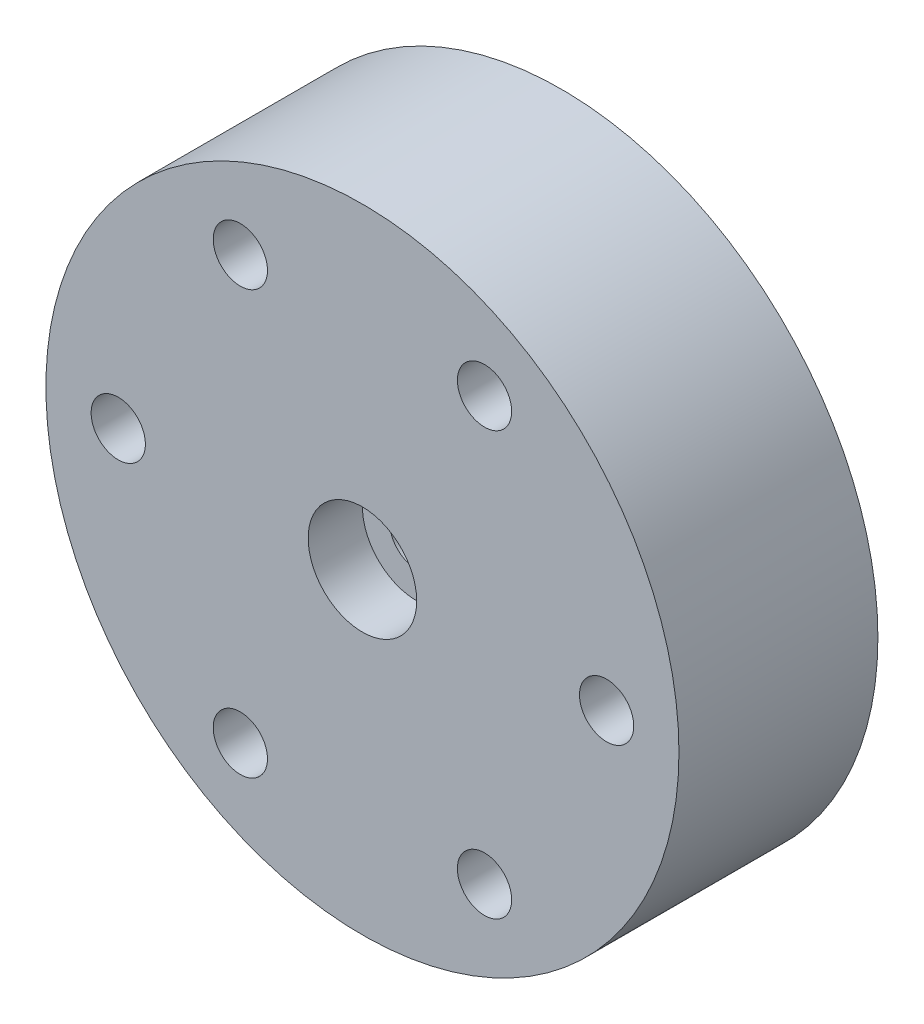
ISO-10303-21;
HEADER;
FILE_DESCRIPTION(('STEP AP214'),'2;1');
FILE_NAME('part.step','',(''),(''),'','','');
FILE_SCHEMA(('AUTOMOTIVE_DESIGN { 1 0 10303 214 1 1 1 1 }'));
ENDSEC;
DATA;
#1=APPLICATION_CONTEXT('core data for automotive mechanical design processes');
#2=APPLICATION_PROTOCOL_DEFINITION('international standard','automotive_design',2000,#1);
#3=PRODUCT_CONTEXT('',#1,'mechanical');
#4=PRODUCT('Part','Part','',(#3));
#5=PRODUCT_RELATED_PRODUCT_CATEGORY('part','',(#4));
#6=PRODUCT_DEFINITION_FORMATION('','',#4);
#7=PRODUCT_DEFINITION_CONTEXT('part definition',#1,'design');
#8=PRODUCT_DEFINITION('design','',#6,#7);
#9=PRODUCT_DEFINITION_SHAPE('','',#8);
#10=(LENGTH_UNIT() NAMED_UNIT(*) SI_UNIT(.MILLI.,.METRE.));
#11=(NAMED_UNIT(*) PLANE_ANGLE_UNIT() SI_UNIT($,.RADIAN.));
#12=(NAMED_UNIT(*) SI_UNIT($,.STERADIAN.) SOLID_ANGLE_UNIT());
#13=UNCERTAINTY_MEASURE_WITH_UNIT(LENGTH_MEASURE(1.E-05),#10,'distance_accuracy_value','');
#14=(GEOMETRIC_REPRESENTATION_CONTEXT(3) GLOBAL_UNCERTAINTY_ASSIGNED_CONTEXT((#13)) GLOBAL_UNIT_ASSIGNED_CONTEXT((#10,
#11,#12)) REPRESENTATION_CONTEXT('',''));
#15=CARTESIAN_POINT('',(0.,0.,0.));
#16=DIRECTION('',(0.,0.,1.));
#17=DIRECTION('',(1.,0.,0.));
#18=AXIS2_PLACEMENT_3D('',#15,#16,#17);
#19=CARTESIAN_POINT('',(0.,0.,11.));
#20=DIRECTION('',(0.,0.,-1.));
#21=DIRECTION('',(-1.,0.,0.));
#22=AXIS2_PLACEMENT_3D('',#19,#20,#21);
#23=CYLINDRICAL_SURFACE('',#22,17.5);
#24=CARTESIAN_POINT('',(0.,0.,11.));
#25=DIRECTION('',(0.,0.,1.));
#26=DIRECTION('',(1.,0.,0.));
#27=AXIS2_PLACEMENT_3D('',#24,#25,#26);
#28=CIRCLE('',#27,17.5);
#29=CARTESIAN_POINT('',(17.5,0.,11.));
#30=VERTEX_POINT('',#29);
#31=EDGE_CURVE('E10',#30,#30,#28,.T.);
#32=ORIENTED_EDGE('',*,*,#31,.F.);
#33=EDGE_LOOP('',(#32));
#34=FACE_BOUND('',#33,.T.);
#35=CARTESIAN_POINT('',(0.,0.,0.));
#36=DIRECTION('',(0.,0.,1.));
#37=DIRECTION('',(1.,0.,0.));
#38=AXIS2_PLACEMENT_3D('',#35,#36,#37);
#39=CIRCLE('',#38,17.5);
#40=CARTESIAN_POINT('',(17.5,0.,0.));
#41=VERTEX_POINT('',#40);
#42=EDGE_CURVE('E45',#41,#41,#39,.T.);
#43=ORIENTED_EDGE('',*,*,#42,.T.);
#44=EDGE_LOOP('',(#43));
#45=FACE_BOUND('',#44,.T.);
#46=ADVANCED_FACE('F42',(#34,#45),#23,.T.);
#47=CARTESIAN_POINT('',(0.,0.,11.));
#48=DIRECTION('',(0.,0.,1.));
#49=DIRECTION('',(1.,0.,0.));
#50=AXIS2_PLACEMENT_3D('',#47,#48,#49);
#51=PLANE('',#50);
#52=CARTESIAN_POINT('',(0.,0.,11.));
#53=DIRECTION('',(0.,0.,1.));
#54=DIRECTION('',(1.,0.,0.));
#55=AXIS2_PLACEMENT_3D('',#52,#53,#54);
#56=CIRCLE('',#55,3.);
#57=CARTESIAN_POINT('',(3.,0.,11.));
#58=VERTEX_POINT('',#57);
#59=EDGE_CURVE('E104',#58,#58,#56,.T.);
#60=ORIENTED_EDGE('',*,*,#59,.F.);
#61=EDGE_LOOP('',(#60));
#62=FACE_BOUND('',#61,.T.);
#63=CARTESIAN_POINT('',(6.75000000000014,-11.6913429510898,11.));
#64=DIRECTION('',(0.,0.,1.));
#65=DIRECTION('',(0.50000000000001,-0.866025403784433,0.));
#66=AXIS2_PLACEMENT_3D('',#63,#64,#65);
#67=CIRCLE('',#66,1.5);
#68=CARTESIAN_POINT('',(7.50000000000015,-12.9903810567665,11.));
#69=VERTEX_POINT('',#68);
#70=EDGE_CURVE('E72',#69,#69,#67,.T.);
#71=ORIENTED_EDGE('',*,*,#70,.F.);
#72=EDGE_LOOP('',(#71));
#73=FACE_BOUND('',#72,.T.);
#74=CARTESIAN_POINT('',(-6.74999999999989,-11.69134295109,11.));
#75=DIRECTION('',(0.,0.,1.));
#76=DIRECTION('',(-0.499999999999992,-0.866025403784443,0.));
#77=AXIS2_PLACEMENT_3D('',#74,#75,#76);
#78=CIRCLE('',#77,1.5);
#79=CARTESIAN_POINT('',(-7.49999999999988,-12.9903810567666,11.));
#80=VERTEX_POINT('',#79);
#81=EDGE_CURVE('E81',#80,#80,#78,.T.);
#82=ORIENTED_EDGE('',*,*,#81,.F.);
#83=EDGE_LOOP('',(#82));
#84=FACE_BOUND('',#83,.T.);
#85=CARTESIAN_POINT('',(-13.5,0.,11.));
#86=DIRECTION('',(0.,0.,1.));
#87=DIRECTION('',(-1.,0.,0.));
#88=AXIS2_PLACEMENT_3D('',#85,#86,#87);
#89=CIRCLE('',#88,1.5);
#90=CARTESIAN_POINT('',(-15.,0.,11.));
#91=VERTEX_POINT('',#90);
#92=EDGE_CURVE('E89',#91,#91,#89,.T.);
#93=ORIENTED_EDGE('',*,*,#92,.F.);
#94=EDGE_LOOP('',(#93));
#95=FACE_BOUND('',#94,.T.);
#96=CARTESIAN_POINT('',(-6.75000000000006,11.6913429510899,11.));
#97=DIRECTION('',(0.,0.,1.));
#98=DIRECTION('',(-0.500000000000004,0.866025403784436,0.));
#99=AXIS2_PLACEMENT_3D('',#96,#97,#98);
#100=CIRCLE('',#99,1.5);
#101=CARTESIAN_POINT('',(-7.50000000000006,12.9903810567665,11.));
#102=VERTEX_POINT('',#101);
#103=EDGE_CURVE('E97',#102,#102,#100,.T.);
#104=ORIENTED_EDGE('',*,*,#103,.F.);
#105=EDGE_LOOP('',(#104));
#106=FACE_BOUND('',#105,.T.);
#107=CARTESIAN_POINT('',(6.74999999999997,11.6913429510899,11.));
#108=DIRECTION('',(0.,0.,1.));
#109=DIRECTION('',(0.499999999999998,0.86602540378444,0.));
#110=AXIS2_PLACEMENT_3D('',#107,#108,#109);
#111=CIRCLE('',#110,1.5);
#112=CARTESIAN_POINT('',(7.49999999999997,12.9903810567666,11.));
#113=VERTEX_POINT('',#112);
#114=EDGE_CURVE('E64',#113,#113,#111,.T.);
#115=ORIENTED_EDGE('',*,*,#114,.F.);
#116=EDGE_LOOP('',(#115));
#117=FACE_BOUND('',#116,.T.);
#118=CARTESIAN_POINT('',(13.5,0.,11.));
#119=DIRECTION('',(0.,0.,1.));
#120=DIRECTION('',(1.,0.,0.));
#121=AXIS2_PLACEMENT_3D('',#118,#119,#120);
#122=CIRCLE('',#121,1.5);
#123=CARTESIAN_POINT('',(15.,0.,11.));
#124=VERTEX_POINT('',#123);
#125=EDGE_CURVE('E56',#124,#124,#122,.T.);
#126=ORIENTED_EDGE('',*,*,#125,.F.);
#127=EDGE_LOOP('',(#126));
#128=FACE_BOUND('',#127,.T.);
#129=ORIENTED_EDGE('',*,*,#31,.T.);
#130=EDGE_LOOP('',(#129));
#131=FACE_BOUND('',#130,.T.);
#132=ADVANCED_FACE('F141',(#62,#73,#84,#95,#106,#117,#128,#131),#51,.T.);
#133=CARTESIAN_POINT('',(0.,0.,0.));
#134=DIRECTION('',(0.,0.,1.));
#135=DIRECTION('',(1.,0.,0.));
#136=AXIS2_PLACEMENT_3D('',#133,#134,#135);
#137=PLANE('',#136);
#138=ORIENTED_EDGE('',*,*,#42,.F.);
#139=EDGE_LOOP('',(#138));
#140=FACE_BOUND('',#139,.T.);
#141=ADVANCED_FACE('F144',(#140),#137,.F.);
#142=CARTESIAN_POINT('',(13.5,0.,5.));
#143=DIRECTION('',(0.,0.,1.));
#144=DIRECTION('',(1.,0.,0.));
#145=AXIS2_PLACEMENT_3D('',#142,#143,#144);
#146=CYLINDRICAL_SURFACE('',#145,1.5);
#147=CARTESIAN_POINT('',(13.5,0.,5.));
#148=DIRECTION('',(0.,0.,1.));
#149=DIRECTION('',(1.,0.,0.));
#150=AXIS2_PLACEMENT_3D('',#147,#148,#149);
#151=CIRCLE('',#150,1.5);
#152=CARTESIAN_POINT('',(15.,0.,5.));
#153=VERTEX_POINT('',#152);
#154=EDGE_CURVE('E54',#153,#153,#151,.T.);
#155=ORIENTED_EDGE('',*,*,#154,.F.);
#156=EDGE_LOOP('',(#155));
#157=FACE_BOUND('',#156,.T.);
#158=ORIENTED_EDGE('',*,*,#125,.T.);
#159=EDGE_LOOP('',(#158));
#160=FACE_BOUND('',#159,.T.);
#161=ADVANCED_FACE('F158',(#157,#160),#146,.F.);
#162=CARTESIAN_POINT('',(13.5,0.,5.));
#163=DIRECTION('',(0.,0.,1.));
#164=DIRECTION('',(1.,0.,0.));
#165=AXIS2_PLACEMENT_3D('',#162,#163,#164);
#166=PLANE('',#165);
#167=ORIENTED_EDGE('',*,*,#154,.T.);
#168=EDGE_LOOP('',(#167));
#169=FACE_BOUND('',#168,.T.);
#170=ADVANCED_FACE('F160',(#169),#166,.T.);
#171=CARTESIAN_POINT('',(6.74999999999997,11.6913429510899,5.));
#172=DIRECTION('',(0.,0.,1.));
#173=DIRECTION('',(1.,0.,0.));
#174=AXIS2_PLACEMENT_3D('',#171,#172,#173);
#175=CYLINDRICAL_SURFACE('',#174,1.5);
#176=CARTESIAN_POINT('',(6.74999999999997,11.6913429510899,5.));
#177=DIRECTION('',(0.,0.,1.));
#178=DIRECTION('',(0.499999999999998,0.86602540378444,0.));
#179=AXIS2_PLACEMENT_3D('',#176,#177,#178);
#180=CIRCLE('',#179,1.5);
#181=CARTESIAN_POINT('',(7.49999999999997,12.9903810567666,5.));
#182=VERTEX_POINT('',#181);
#183=EDGE_CURVE('E60',#182,#182,#180,.T.);
#184=ORIENTED_EDGE('',*,*,#183,.F.);
#185=EDGE_LOOP('',(#184));
#186=FACE_BOUND('',#185,.T.);
#187=ORIENTED_EDGE('',*,*,#114,.T.);
#188=EDGE_LOOP('',(#187));
#189=FACE_BOUND('',#188,.T.);
#190=ADVANCED_FACE('F167',(#186,#189),#175,.F.);
#191=CARTESIAN_POINT('',(6.74999999999997,11.6913429510899,5.));
#192=DIRECTION('',(0.,0.,1.));
#193=DIRECTION('',(0.499999999999998,0.86602540378444,0.));
#194=AXIS2_PLACEMENT_3D('',#191,#192,#193);
#195=PLANE('',#194);
#196=ORIENTED_EDGE('',*,*,#183,.T.);
#197=EDGE_LOOP('',(#196));
#198=FACE_BOUND('',#197,.T.);
#199=ADVANCED_FACE('F210',(#198),#195,.T.);
#200=CARTESIAN_POINT('',(-6.75000000000006,11.6913429510899,5.));
#201=DIRECTION('',(0.,0.,1.));
#202=DIRECTION('',(1.,0.,0.));
#203=AXIS2_PLACEMENT_3D('',#200,#201,#202);
#204=CYLINDRICAL_SURFACE('',#203,1.5);
#205=CARTESIAN_POINT('',(-6.75000000000006,11.6913429510899,5.));
#206=DIRECTION('',(0.,0.,1.));
#207=DIRECTION('',(-0.500000000000004,0.866025403784436,0.));
#208=AXIS2_PLACEMENT_3D('',#205,#206,#207);
#209=CIRCLE('',#208,1.5);
#210=CARTESIAN_POINT('',(-7.50000000000006,12.9903810567665,5.));
#211=VERTEX_POINT('',#210);
#212=EDGE_CURVE('E68',#211,#211,#209,.T.);
#213=ORIENTED_EDGE('',*,*,#212,.F.);
#214=EDGE_LOOP('',(#213));
#215=FACE_BOUND('',#214,.T.);
#216=ORIENTED_EDGE('',*,*,#103,.T.);
#217=EDGE_LOOP('',(#216));
#218=FACE_BOUND('',#217,.T.);
#219=ADVANCED_FACE('F221',(#215,#218),#204,.F.);
#220=CARTESIAN_POINT('',(-6.75000000000006,11.6913429510899,5.));
#221=DIRECTION('',(0.,0.,1.));
#222=DIRECTION('',(-0.500000000000004,0.866025403784436,0.));
#223=AXIS2_PLACEMENT_3D('',#220,#221,#222);
#224=PLANE('',#223);
#225=ORIENTED_EDGE('',*,*,#212,.T.);
#226=EDGE_LOOP('',(#225));
#227=FACE_BOUND('',#226,.T.);
#228=ADVANCED_FACE('F232',(#227),#224,.T.);
#229=CARTESIAN_POINT('',(-13.5,0.,5.));
#230=DIRECTION('',(0.,0.,1.));
#231=DIRECTION('',(1.,0.,0.));
#232=AXIS2_PLACEMENT_3D('',#229,#230,#231);
#233=CYLINDRICAL_SURFACE('',#232,1.5);
#234=CARTESIAN_POINT('',(-13.5,0.,5.));
#235=DIRECTION('',(0.,0.,1.));
#236=DIRECTION('',(-1.,0.,0.));
#237=AXIS2_PLACEMENT_3D('',#234,#235,#236);
#238=CIRCLE('',#237,1.5);
#239=CARTESIAN_POINT('',(-15.,0.,5.));
#240=VERTEX_POINT('',#239);
#241=EDGE_CURVE('E93',#240,#240,#238,.T.);
#242=ORIENTED_EDGE('',*,*,#241,.F.);
#243=EDGE_LOOP('',(#242));
#244=FACE_BOUND('',#243,.T.);
#245=ORIENTED_EDGE('',*,*,#92,.T.);
#246=EDGE_LOOP('',(#245));
#247=FACE_BOUND('',#246,.T.);
#248=ADVANCED_FACE('F243',(#244,#247),#233,.F.);
#249=CARTESIAN_POINT('',(-13.5,0.,5.));
#250=DIRECTION('',(0.,0.,1.));
#251=DIRECTION('',(-1.,0.,0.));
#252=AXIS2_PLACEMENT_3D('',#249,#250,#251);
#253=PLANE('',#252);
#254=ORIENTED_EDGE('',*,*,#241,.T.);
#255=EDGE_LOOP('',(#254));
#256=FACE_BOUND('',#255,.T.);
#257=ADVANCED_FACE('F254',(#256),#253,.T.);
#258=CARTESIAN_POINT('',(-6.74999999999989,-11.69134295109,5.));
#259=DIRECTION('',(0.,0.,1.));
#260=DIRECTION('',(1.,0.,0.));
#261=AXIS2_PLACEMENT_3D('',#258,#259,#260);
#262=CYLINDRICAL_SURFACE('',#261,1.5);
#263=CARTESIAN_POINT('',(-6.74999999999989,-11.69134295109,5.));
#264=DIRECTION('',(0.,0.,1.));
#265=DIRECTION('',(-0.499999999999992,-0.866025403784443,0.));
#266=AXIS2_PLACEMENT_3D('',#263,#264,#265);
#267=CIRCLE('',#266,1.5);
#268=CARTESIAN_POINT('',(-7.49999999999988,-12.9903810567666,5.));
#269=VERTEX_POINT('',#268);
#270=EDGE_CURVE('E85',#269,#269,#267,.T.);
#271=ORIENTED_EDGE('',*,*,#270,.F.);
#272=EDGE_LOOP('',(#271));
#273=FACE_BOUND('',#272,.T.);
#274=ORIENTED_EDGE('',*,*,#81,.T.);
#275=EDGE_LOOP('',(#274));
#276=FACE_BOUND('',#275,.T.);
#277=ADVANCED_FACE('F265',(#273,#276),#262,.F.);
#278=CARTESIAN_POINT('',(-6.74999999999989,-11.69134295109,5.));
#279=DIRECTION('',(0.,0.,1.));
#280=DIRECTION('',(-0.499999999999992,-0.866025403784443,0.));
#281=AXIS2_PLACEMENT_3D('',#278,#279,#280);
#282=PLANE('',#281);
#283=ORIENTED_EDGE('',*,*,#270,.T.);
#284=EDGE_LOOP('',(#283));
#285=FACE_BOUND('',#284,.T.);
#286=ADVANCED_FACE('F276',(#285),#282,.T.);
#287=CARTESIAN_POINT('',(6.75000000000014,-11.6913429510898,5.));
#288=DIRECTION('',(0.,0.,1.));
#289=DIRECTION('',(1.,0.,0.));
#290=AXIS2_PLACEMENT_3D('',#287,#288,#289);
#291=CYLINDRICAL_SURFACE('',#290,1.5);
#292=CARTESIAN_POINT('',(6.75000000000014,-11.6913429510898,5.));
#293=DIRECTION('',(0.,0.,1.));
#294=DIRECTION('',(0.50000000000001,-0.866025403784433,0.));
#295=AXIS2_PLACEMENT_3D('',#292,#293,#294);
#296=CIRCLE('',#295,1.5);
#297=CARTESIAN_POINT('',(7.50000000000015,-12.9903810567665,5.));
#298=VERTEX_POINT('',#297);
#299=EDGE_CURVE('E76',#298,#298,#296,.T.);
#300=ORIENTED_EDGE('',*,*,#299,.F.);
#301=EDGE_LOOP('',(#300));
#302=FACE_BOUND('',#301,.T.);
#303=ORIENTED_EDGE('',*,*,#70,.T.);
#304=EDGE_LOOP('',(#303));
#305=FACE_BOUND('',#304,.T.);
#306=ADVANCED_FACE('F287',(#302,#305),#291,.F.);
#307=CARTESIAN_POINT('',(6.75000000000014,-11.6913429510898,5.));
#308=DIRECTION('',(0.,0.,1.));
#309=DIRECTION('',(0.50000000000001,-0.866025403784433,0.));
#310=AXIS2_PLACEMENT_3D('',#307,#308,#309);
#311=PLANE('',#310);
#312=ORIENTED_EDGE('',*,*,#299,.T.);
#313=EDGE_LOOP('',(#312));
#314=FACE_BOUND('',#313,.T.);
#315=ADVANCED_FACE('F137',(#314),#311,.T.);
#316=CARTESIAN_POINT('',(0.,0.,8.));
#317=DIRECTION('',(0.,0.,1.));
#318=DIRECTION('',(1.,0.,0.));
#319=AXIS2_PLACEMENT_3D('',#316,#317,#318);
#320=CYLINDRICAL_SURFACE('',#319,3.);
#321=CARTESIAN_POINT('',(0.,0.,8.));
#322=DIRECTION('',(0.,0.,1.));
#323=DIRECTION('',(1.,0.,0.));
#324=AXIS2_PLACEMENT_3D('',#321,#322,#323);
#325=CIRCLE('',#324,3.);
#326=CARTESIAN_POINT('',(3.,0.,8.));
#327=VERTEX_POINT('',#326);
#328=EDGE_CURVE('E77',#327,#327,#325,.T.);
#329=ORIENTED_EDGE('',*,*,#328,.F.);
#330=EDGE_LOOP('',(#329));
#331=FACE_BOUND('',#330,.T.);
#332=ORIENTED_EDGE('',*,*,#59,.T.);
#333=EDGE_LOOP('',(#332));
#334=FACE_BOUND('',#333,.T.);
#335=ADVANCED_FACE('F131',(#331,#334),#320,.F.);
#336=CARTESIAN_POINT('',(0.,0.,8.));
#337=DIRECTION('',(0.,0.,1.));
#338=DIRECTION('',(1.,0.,0.));
#339=AXIS2_PLACEMENT_3D('',#336,#337,#338);
#340=PLANE('',#339);
#341=CARTESIAN_POINT('',(0.,0.,8.));
#342=DIRECTION('',(0.,0.,1.));
#343=DIRECTION('',(1.,0.,0.));
#344=AXIS2_PLACEMENT_3D('',#341,#342,#343);
#345=CIRCLE('',#344,1.5);
#346=CARTESIAN_POINT('',(1.5,0.,8.));
#347=VERTEX_POINT('',#346);
#348=EDGE_CURVE('E112',#347,#347,#345,.T.);
#349=ORIENTED_EDGE('',*,*,#348,.F.);
#350=EDGE_LOOP('',(#349));
#351=FACE_BOUND('',#350,.T.);
#352=ORIENTED_EDGE('',*,*,#328,.T.);
#353=EDGE_LOOP('',(#352));
#354=FACE_BOUND('',#353,.T.);
#355=ADVANCED_FACE('F125',(#351,#354),#340,.T.);
#356=CARTESIAN_POINT('',(0.,0.,2.));
#357=DIRECTION('',(0.,0.,1.));
#358=DIRECTION('',(1.,0.,0.));
#359=AXIS2_PLACEMENT_3D('',#356,#357,#358);
#360=CYLINDRICAL_SURFACE('',#359,1.5);
#361=CARTESIAN_POINT('',(0.,0.,2.));
#362=DIRECTION('',(0.,0.,1.));
#363=DIRECTION('',(1.,0.,0.));
#364=AXIS2_PLACEMENT_3D('',#361,#362,#363);
#365=CIRCLE('',#364,1.5);
#366=CARTESIAN_POINT('',(1.5,0.,2.));
#367=VERTEX_POINT('',#366);
#368=EDGE_CURVE('E108',#367,#367,#365,.T.);
#369=ORIENTED_EDGE('',*,*,#368,.F.);
#370=EDGE_LOOP('',(#369));
#371=FACE_BOUND('',#370,.T.);
#372=ORIENTED_EDGE('',*,*,#348,.T.);
#373=EDGE_LOOP('',(#372));
#374=FACE_BOUND('',#373,.T.);
#375=ADVANCED_FACE('F122',(#371,#374),#360,.F.);
#376=CARTESIAN_POINT('',(0.,0.,2.));
#377=DIRECTION('',(0.,0.,1.));
#378=DIRECTION('',(1.,0.,0.));
#379=AXIS2_PLACEMENT_3D('',#376,#377,#378);
#380=PLANE('',#379);
#381=ORIENTED_EDGE('',*,*,#368,.T.);
#382=EDGE_LOOP('',(#381));
#383=FACE_BOUND('',#382,.T.);
#384=ADVANCED_FACE('F120',(#383),#380,.T.);
#385=CLOSED_SHELL('',(#46,#132,#141,#161,#170,#190,#199,#219,#228,#248,#257,#277,#286,#306,#315,
#335,#355,#375,#384));
#386=MANIFOLD_SOLID_BREP('B2',#385);
#387=ADVANCED_BREP_SHAPE_REPRESENTATION('',(#18,#386),#14);
#388=SHAPE_DEFINITION_REPRESENTATION(#9,#387);
ENDSEC;
END-ISO-10303-21;
